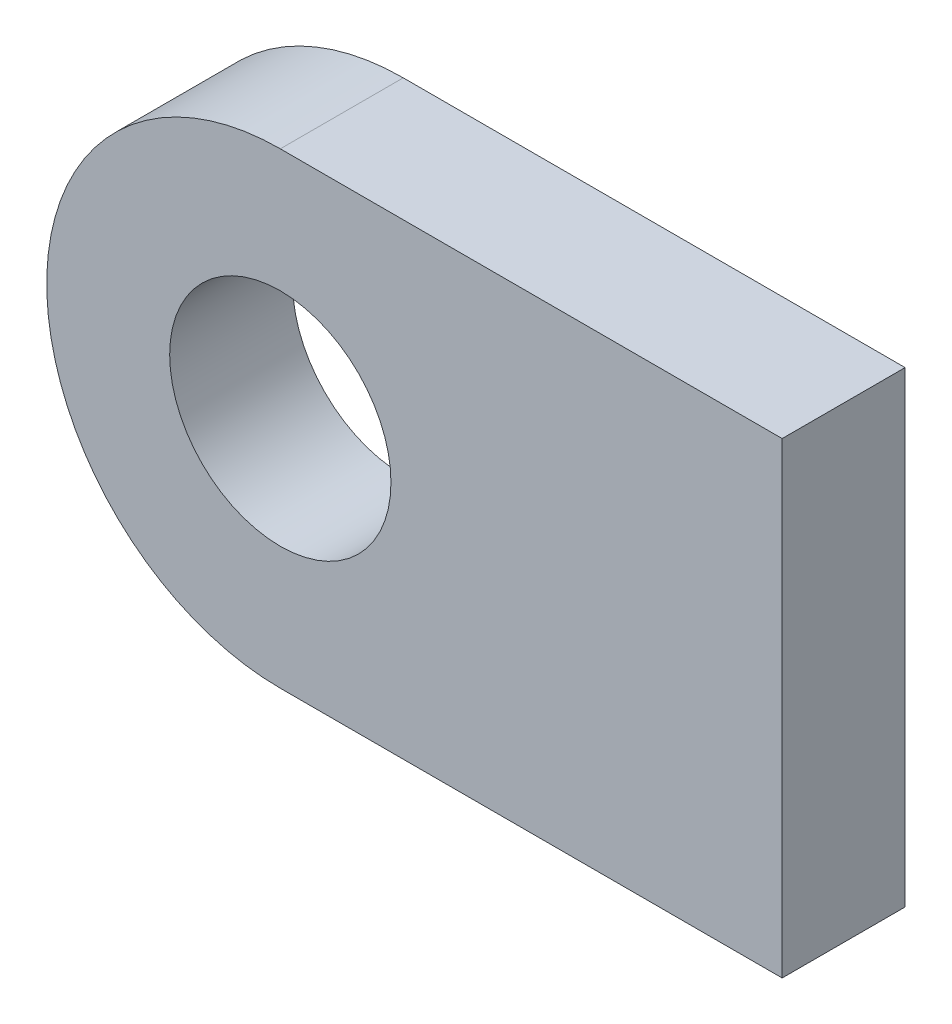
ISO-10303-21;
HEADER;
FILE_DESCRIPTION(('STEP AP214'),'2;1');
FILE_NAME('part.step','',(''),(''),'','','');
FILE_SCHEMA(('AUTOMOTIVE_DESIGN { 1 0 10303 214 1 1 1 1 }'));
ENDSEC;
DATA;
#1=APPLICATION_CONTEXT('core data for automotive mechanical design processes');
#2=APPLICATION_PROTOCOL_DEFINITION('international standard','automotive_design',2000,#1);
#3=PRODUCT_CONTEXT('',#1,'mechanical');
#4=PRODUCT('Part','Part','',(#3));
#5=PRODUCT_RELATED_PRODUCT_CATEGORY('part','',(#4));
#6=PRODUCT_DEFINITION_FORMATION('','',#4);
#7=PRODUCT_DEFINITION_CONTEXT('part definition',#1,'design');
#8=PRODUCT_DEFINITION('design','',#6,#7);
#9=PRODUCT_DEFINITION_SHAPE('','',#8);
#10=(LENGTH_UNIT() NAMED_UNIT(*) SI_UNIT(.MILLI.,.METRE.));
#11=(NAMED_UNIT(*) PLANE_ANGLE_UNIT() SI_UNIT($,.RADIAN.));
#12=(NAMED_UNIT(*) SI_UNIT($,.STERADIAN.) SOLID_ANGLE_UNIT());
#13=UNCERTAINTY_MEASURE_WITH_UNIT(LENGTH_MEASURE(1.E-05),#10,'distance_accuracy_value','');
#14=(GEOMETRIC_REPRESENTATION_CONTEXT(3) GLOBAL_UNCERTAINTY_ASSIGNED_CONTEXT((#13)) GLOBAL_UNIT_ASSIGNED_CONTEXT((#10,
#11,#12)) REPRESENTATION_CONTEXT('',''));
#15=CARTESIAN_POINT('',(0.,0.,0.));
#16=DIRECTION('',(0.,0.,1.));
#17=DIRECTION('',(1.,0.,0.));
#18=AXIS2_PLACEMENT_3D('',#15,#16,#17);
#19=CARTESIAN_POINT('',(0.,0.,2.5));
#20=DIRECTION('',(0.,0.,1.));
#21=DIRECTION('',(1.,0.,0.));
#22=AXIS2_PLACEMENT_3D('',#19,#20,#21);
#23=PLANE('',#22);
#24=CARTESIAN_POINT('',(0.,0.,2.5));
#25=DIRECTION('',(0.,0.,1.));
#26=DIRECTION('',(1.,0.,0.));
#27=AXIS2_PLACEMENT_3D('',#24,#25,#26);
#28=CIRCLE('',#27,9.5);
#29=CARTESIAN_POINT('',(0.,9.5,2.5));
#30=VERTEX_POINT('',#29);
#31=CARTESIAN_POINT('',(0.,-9.5,2.5));
#32=VERTEX_POINT('',#31);
#33=EDGE_CURVE('E85',#30,#32,#28,.T.);
#34=ORIENTED_EDGE('',*,*,#33,.T.);
#35=DIRECTION('',(1.,0.,0.));
#36=VECTOR('',#35,1.);
#37=CARTESIAN_POINT('',(20.41,-9.5,2.5));
#38=LINE('',#37,#36);
#39=CARTESIAN_POINT('',(20.41,-9.5,2.5));
#40=VERTEX_POINT('',#39);
#41=EDGE_CURVE('E80',#32,#40,#38,.T.);
#42=ORIENTED_EDGE('',*,*,#41,.T.);
#43=DIRECTION('',(0.,1.,0.));
#44=VECTOR('',#43,1.);
#45=CARTESIAN_POINT('',(20.41,9.5,2.5));
#46=LINE('',#45,#44);
#47=CARTESIAN_POINT('',(20.41,9.5,2.5));
#48=VERTEX_POINT('',#47);
#49=EDGE_CURVE('E83',#40,#48,#46,.T.);
#50=ORIENTED_EDGE('',*,*,#49,.T.);
#51=DIRECTION('',(-1.,0.,0.));
#52=VECTOR('',#51,1.);
#53=CARTESIAN_POINT('',(0.,9.5,2.5));
#54=LINE('',#53,#52);
#55=EDGE_CURVE('E50',#48,#30,#54,.T.);
#56=ORIENTED_EDGE('',*,*,#55,.T.);
#57=EDGE_LOOP('',(#34,#42,#50,#56));
#58=FACE_BOUND('',#57,.T.);
#59=CARTESIAN_POINT('',(0.,0.,2.5));
#60=DIRECTION('',(0.,0.,1.));
#61=DIRECTION('',(1.,0.,0.));
#62=AXIS2_PLACEMENT_3D('',#59,#60,#61);
#63=CIRCLE('',#62,4.5);
#64=CARTESIAN_POINT('',(4.5,0.,2.5));
#65=VERTEX_POINT('',#64);
#66=EDGE_CURVE('E100',#65,#65,#63,.T.);
#67=ORIENTED_EDGE('',*,*,#66,.F.);
#68=EDGE_LOOP('',(#67));
#69=FACE_BOUND('',#68,.T.);
#70=ADVANCED_FACE('F33',(#58,#69),#23,.T.);
#71=CARTESIAN_POINT('',(0.,0.,-2.5));
#72=DIRECTION('',(0.,0.,1.));
#73=DIRECTION('',(1.,0.,0.));
#74=AXIS2_PLACEMENT_3D('',#71,#72,#73);
#75=PLANE('',#74);
#76=CARTESIAN_POINT('',(0.,0.,-2.5));
#77=DIRECTION('',(0.,0.,1.));
#78=DIRECTION('',(1.,0.,0.));
#79=AXIS2_PLACEMENT_3D('',#76,#77,#78);
#80=CIRCLE('',#79,9.5);
#81=CARTESIAN_POINT('',(0.,9.5,-2.5));
#82=VERTEX_POINT('',#81);
#83=CARTESIAN_POINT('',(0.,-9.5,-2.5));
#84=VERTEX_POINT('',#83);
#85=EDGE_CURVE('E97',#82,#84,#80,.T.);
#86=ORIENTED_EDGE('',*,*,#85,.F.);
#87=DIRECTION('',(-1.,0.,0.));
#88=VECTOR('',#87,1.);
#89=CARTESIAN_POINT('',(0.,9.5,-2.5));
#90=LINE('',#89,#88);
#91=CARTESIAN_POINT('',(20.41,9.5,-2.5));
#92=VERTEX_POINT('',#91);
#93=EDGE_CURVE('E73',#92,#82,#90,.T.);
#94=ORIENTED_EDGE('',*,*,#93,.F.);
#95=DIRECTION('',(0.,1.,0.));
#96=VECTOR('',#95,1.);
#97=CARTESIAN_POINT('',(20.41,9.5,-2.5));
#98=LINE('',#97,#96);
#99=CARTESIAN_POINT('',(20.41,-9.5,-2.5));
#100=VERTEX_POINT('',#99);
#101=EDGE_CURVE('E67',#100,#92,#98,.T.);
#102=ORIENTED_EDGE('',*,*,#101,.F.);
#103=DIRECTION('',(1.,0.,0.));
#104=VECTOR('',#103,1.);
#105=CARTESIAN_POINT('',(20.41,-9.5,-2.5));
#106=LINE('',#105,#104);
#107=EDGE_CURVE('E89',#84,#100,#106,.T.);
#108=ORIENTED_EDGE('',*,*,#107,.F.);
#109=EDGE_LOOP('',(#86,#94,#102,#108));
#110=FACE_BOUND('',#109,.T.);
#111=CARTESIAN_POINT('',(0.,0.,-2.5));
#112=DIRECTION('',(0.,0.,1.));
#113=DIRECTION('',(1.,0.,0.));
#114=AXIS2_PLACEMENT_3D('',#111,#112,#113);
#115=CIRCLE('',#114,4.5);
#116=CARTESIAN_POINT('',(4.5,0.,-2.5));
#117=VERTEX_POINT('',#116);
#118=EDGE_CURVE('E112',#117,#117,#115,.T.);
#119=ORIENTED_EDGE('',*,*,#118,.T.);
#120=EDGE_LOOP('',(#119));
#121=FACE_BOUND('',#120,.T.);
#122=ADVANCED_FACE('F108',(#110,#121),#75,.F.);
#123=CARTESIAN_POINT('',(0.,0.,2.5));
#124=DIRECTION('',(0.,0.,-1.));
#125=DIRECTION('',(-1.,0.,0.));
#126=AXIS2_PLACEMENT_3D('',#123,#124,#125);
#127=CYLINDRICAL_SURFACE('',#126,9.5);
#128=ORIENTED_EDGE('',*,*,#85,.T.);
#129=DIRECTION('',(0.,0.,-1.));
#130=VECTOR('',#129,1.);
#131=CARTESIAN_POINT('',(0.,-9.5,2.5));
#132=LINE('',#131,#130);
#133=EDGE_CURVE('E11',#32,#84,#132,.T.);
#134=ORIENTED_EDGE('',*,*,#133,.F.);
#135=ORIENTED_EDGE('',*,*,#33,.F.);
#136=DIRECTION('',(0.,0.,-1.));
#137=VECTOR('',#136,1.);
#138=CARTESIAN_POINT('',(0.,9.5,2.5));
#139=LINE('',#138,#137);
#140=EDGE_CURVE('E93',#30,#82,#139,.T.);
#141=ORIENTED_EDGE('',*,*,#140,.T.);
#142=EDGE_LOOP('',(#128,#134,#135,#141));
#143=FACE_BOUND('',#142,.T.);
#144=ADVANCED_FACE('F35',(#143),#127,.T.);
#145=CARTESIAN_POINT('',(20.41,-9.5,2.5));
#146=DIRECTION('',(0.,1.,0.));
#147=DIRECTION('',(0.,0.,1.));
#148=AXIS2_PLACEMENT_3D('',#145,#146,#147);
#149=PLANE('',#148);
#150=ORIENTED_EDGE('',*,*,#107,.T.);
#151=DIRECTION('',(0.,0.,-1.));
#152=VECTOR('',#151,1.);
#153=CARTESIAN_POINT('',(20.41,-9.5,2.5));
#154=LINE('',#153,#152);
#155=EDGE_CURVE('E42',#40,#100,#154,.T.);
#156=ORIENTED_EDGE('',*,*,#155,.F.);
#157=ORIENTED_EDGE('',*,*,#41,.F.);
#158=ORIENTED_EDGE('',*,*,#133,.T.);
#159=EDGE_LOOP('',(#150,#156,#157,#158));
#160=FACE_BOUND('',#159,.T.);
#161=ADVANCED_FACE('F88',(#160),#149,.F.);
#162=CARTESIAN_POINT('',(20.41,9.5,2.5));
#163=DIRECTION('',(-1.,0.,0.));
#164=DIRECTION('',(0.,0.,1.));
#165=AXIS2_PLACEMENT_3D('',#162,#163,#164);
#166=PLANE('',#165);
#167=ORIENTED_EDGE('',*,*,#101,.T.);
#168=DIRECTION('',(0.,0.,-1.));
#169=VECTOR('',#168,1.);
#170=CARTESIAN_POINT('',(20.41,9.5,2.5));
#171=LINE('',#170,#169);
#172=EDGE_CURVE('E90',#48,#92,#171,.T.);
#173=ORIENTED_EDGE('',*,*,#172,.F.);
#174=ORIENTED_EDGE('',*,*,#49,.F.);
#175=ORIENTED_EDGE('',*,*,#155,.T.);
#176=EDGE_LOOP('',(#167,#173,#174,#175));
#177=FACE_BOUND('',#176,.T.);
#178=ADVANCED_FACE('F91',(#177),#166,.F.);
#179=CARTESIAN_POINT('',(0.,9.5,2.5));
#180=DIRECTION('',(0.,-1.,0.));
#181=DIRECTION('',(0.,0.,-1.));
#182=AXIS2_PLACEMENT_3D('',#179,#180,#181);
#183=PLANE('',#182);
#184=ORIENTED_EDGE('',*,*,#93,.T.);
#185=ORIENTED_EDGE('',*,*,#140,.F.);
#186=ORIENTED_EDGE('',*,*,#55,.F.);
#187=ORIENTED_EDGE('',*,*,#172,.T.);
#188=EDGE_LOOP('',(#184,#185,#186,#187));
#189=FACE_BOUND('',#188,.T.);
#190=ADVANCED_FACE('F105',(#189),#183,.F.);
#191=CARTESIAN_POINT('',(0.,0.,2.5));
#192=DIRECTION('',(0.,0.,-1.));
#193=DIRECTION('',(-1.,0.,0.));
#194=AXIS2_PLACEMENT_3D('',#191,#192,#193);
#195=CYLINDRICAL_SURFACE('',#194,4.5);
#196=ORIENTED_EDGE('',*,*,#66,.T.);
#197=EDGE_LOOP('',(#196));
#198=FACE_BOUND('',#197,.T.);
#199=ORIENTED_EDGE('',*,*,#118,.F.);
#200=EDGE_LOOP('',(#199));
#201=FACE_BOUND('',#200,.T.);
#202=ADVANCED_FACE('F118',(#198,#201),#195,.F.);
#203=CLOSED_SHELL('',(#70,#122,#144,#161,#178,#190,#202));
#204=MANIFOLD_SOLID_BREP('B2',#203);
#205=ADVANCED_BREP_SHAPE_REPRESENTATION('',(#18,#204),#14);
#206=SHAPE_DEFINITION_REPRESENTATION(#9,#205);
ENDSEC;
END-ISO-10303-21;
